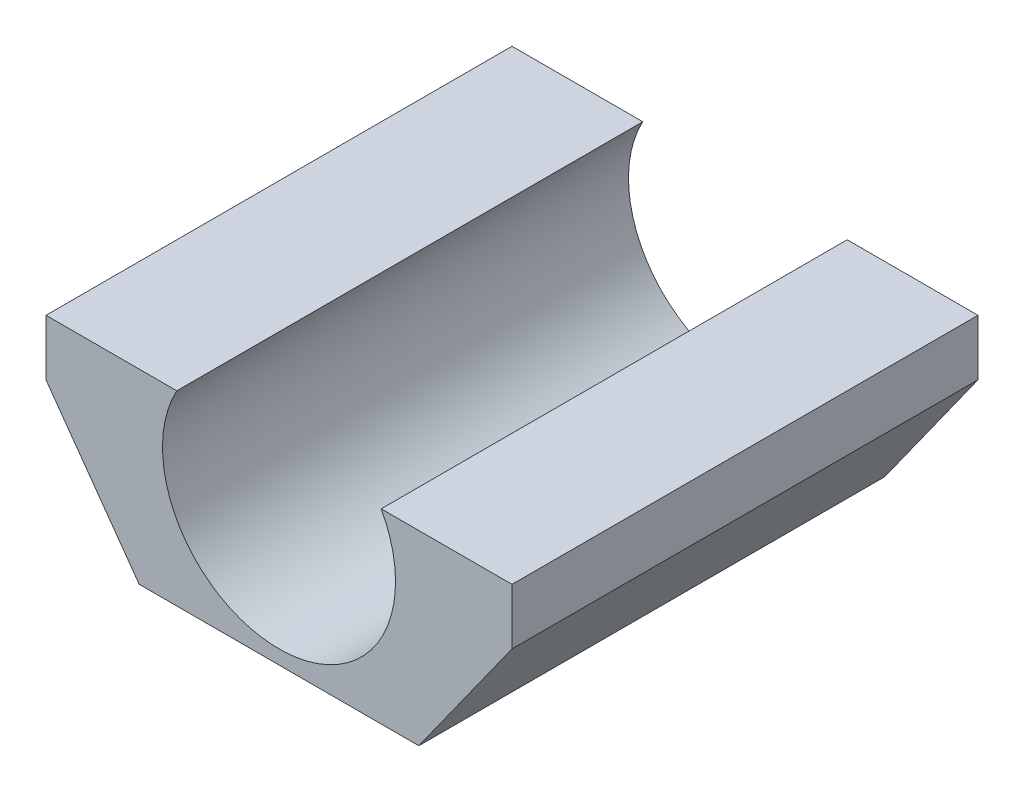
ISO-10303-21;
HEADER;
FILE_DESCRIPTION(('STEP AP214'),'2;1');
FILE_NAME('part.step','',(''),(''),'','','');
FILE_SCHEMA(('AUTOMOTIVE_DESIGN { 1 0 10303 214 1 1 1 1 }'));
ENDSEC;
DATA;
#1=APPLICATION_CONTEXT('core data for automotive mechanical design processes');
#2=APPLICATION_PROTOCOL_DEFINITION('international standard','automotive_design',2000,#1);
#3=PRODUCT_CONTEXT('',#1,'mechanical');
#4=PRODUCT('Part','Part','',(#3));
#5=PRODUCT_RELATED_PRODUCT_CATEGORY('part','',(#4));
#6=PRODUCT_DEFINITION_FORMATION('','',#4);
#7=PRODUCT_DEFINITION_CONTEXT('part definition',#1,'design');
#8=PRODUCT_DEFINITION('design','',#6,#7);
#9=PRODUCT_DEFINITION_SHAPE('','',#8);
#10=(LENGTH_UNIT() NAMED_UNIT(*) SI_UNIT(.MILLI.,.METRE.));
#11=(NAMED_UNIT(*) PLANE_ANGLE_UNIT() SI_UNIT($,.RADIAN.));
#12=(NAMED_UNIT(*) SI_UNIT($,.STERADIAN.) SOLID_ANGLE_UNIT());
#13=UNCERTAINTY_MEASURE_WITH_UNIT(LENGTH_MEASURE(1.E-05),#10,'distance_accuracy_value','');
#14=(GEOMETRIC_REPRESENTATION_CONTEXT(3) GLOBAL_UNCERTAINTY_ASSIGNED_CONTEXT((#13)) GLOBAL_UNIT_ASSIGNED_CONTEXT((#10,
#11,#12)) REPRESENTATION_CONTEXT('',''));
#15=CARTESIAN_POINT('',(0.,0.,0.));
#16=DIRECTION('',(0.,0.,1.));
#17=DIRECTION('',(1.,0.,0.));
#18=AXIS2_PLACEMENT_3D('',#15,#16,#17);
#19=CARTESIAN_POINT('',(0.,6.,0.));
#20=DIRECTION('',(0.,1.,0.));
#21=DIRECTION('',(0.,0.,1.));
#22=AXIS2_PLACEMENT_3D('',#19,#20,#21);
#23=PLANE('',#22);
#24=DIRECTION('',(-1.,0.,0.));
#25=VECTOR('',#24,1.);
#26=CARTESIAN_POINT('',(0.,6.,50.));
#27=LINE('',#26,#25);
#28=CARTESIAN_POINT('',(25.,6.,50.));
#29=VERTEX_POINT('',#28);
#30=CARTESIAN_POINT('',(10.9658560997307,6.,50.));
#31=VERTEX_POINT('',#30);
#32=EDGE_CURVE('E125',#29,#31,#27,.T.);
#33=ORIENTED_EDGE('',*,*,#32,.F.);
#34=DIRECTION('',(0.,0.,1.));
#35=VECTOR('',#34,1.);
#36=CARTESIAN_POINT('',(25.,6.,50.));
#37=LINE('',#36,#35);
#38=CARTESIAN_POINT('',(25.,6.,0.));
#39=VERTEX_POINT('',#38);
#40=EDGE_CURVE('E114',#39,#29,#37,.T.);
#41=ORIENTED_EDGE('',*,*,#40,.F.);
#42=DIRECTION('',(-1.,0.,0.));
#43=VECTOR('',#42,1.);
#44=CARTESIAN_POINT('',(0.,6.,0.));
#45=LINE('',#44,#43);
#46=CARTESIAN_POINT('',(10.9658560997307,6.,0.));
#47=VERTEX_POINT('',#46);
#48=EDGE_CURVE('E124',#39,#47,#45,.T.);
#49=ORIENTED_EDGE('',*,*,#48,.T.);
#50=DIRECTION('',(0.,0.,-1.));
#51=VECTOR('',#50,1.);
#52=CARTESIAN_POINT('',(10.9658560997307,6.,50.));
#53=LINE('',#52,#51);
#54=EDGE_CURVE('E126',#31,#47,#53,.T.);
#55=ORIENTED_EDGE('',*,*,#54,.F.);
#56=EDGE_LOOP('',(#33,#41,#49,#55));
#57=FACE_BOUND('',#56,.T.);
#58=ADVANCED_FACE('F39',(#57),#23,.T.);
#59=CARTESIAN_POINT('',(-10.9658560997307,6.,50.));
#60=VERTEX_POINT('',#59);
#61=CARTESIAN_POINT('',(-25.,6.,50.));
#62=VERTEX_POINT('',#61);
#63=EDGE_CURVE('E153',#60,#62,#27,.T.);
#64=ORIENTED_EDGE('',*,*,#63,.F.);
#65=DIRECTION('',(0.,0.,-1.));
#66=VECTOR('',#65,1.);
#67=CARTESIAN_POINT('',(-10.9658560997307,6.,50.));
#68=LINE('',#67,#66);
#69=CARTESIAN_POINT('',(-10.9658560997307,6.,0.));
#70=VERTEX_POINT('',#69);
#71=EDGE_CURVE('E154',#70,#60,#68,.F.);
#72=ORIENTED_EDGE('',*,*,#71,.F.);
#73=CARTESIAN_POINT('',(-25.,6.,0.));
#74=VERTEX_POINT('',#73);
#75=EDGE_CURVE('E132',#70,#74,#45,.T.);
#76=ORIENTED_EDGE('',*,*,#75,.T.);
#77=DIRECTION('',(0.,0.,-1.));
#78=VECTOR('',#77,1.);
#79=CARTESIAN_POINT('',(-25.,6.,50.));
#80=LINE('',#79,#78);
#81=EDGE_CURVE('E127',#62,#74,#80,.T.);
#82=ORIENTED_EDGE('',*,*,#81,.F.);
#83=EDGE_LOOP('',(#64,#72,#76,#82));
#84=FACE_BOUND('',#83,.T.);
#85=ADVANCED_FACE('F188',(#84),#23,.T.);
#86=CARTESIAN_POINT('',(-25.,0.,50.));
#87=DIRECTION('',(-1.,0.,0.));
#88=DIRECTION('',(0.,-1.,0.));
#89=AXIS2_PLACEMENT_3D('',#86,#87,#88);
#90=PLANE('',#89);
#91=DIRECTION('',(0.,1.,0.));
#92=VECTOR('',#91,1.);
#93=CARTESIAN_POINT('',(-25.,0.,50.));
#94=LINE('',#93,#92);
#95=CARTESIAN_POINT('',(-25.,0.,50.));
#96=VERTEX_POINT('',#95);
#97=EDGE_CURVE('E144',#96,#62,#94,.T.);
#98=ORIENTED_EDGE('',*,*,#97,.T.);
#99=ORIENTED_EDGE('',*,*,#81,.T.);
#100=DIRECTION('',(0.,1.,0.));
#101=VECTOR('',#100,1.);
#102=CARTESIAN_POINT('',(-25.,0.,0.));
#103=LINE('',#102,#101);
#104=CARTESIAN_POINT('',(-25.,0.,0.));
#105=VERTEX_POINT('',#104);
#106=EDGE_CURVE('E11',#105,#74,#103,.T.);
#107=ORIENTED_EDGE('',*,*,#106,.F.);
#108=DIRECTION('',(0.,0.,-1.));
#109=VECTOR('',#108,1.);
#110=CARTESIAN_POINT('',(-25.,0.,50.));
#111=LINE('',#110,#109);
#112=EDGE_CURVE('E56',#96,#105,#111,.T.);
#113=ORIENTED_EDGE('',*,*,#112,.F.);
#114=EDGE_LOOP('',(#98,#99,#107,#113));
#115=FACE_BOUND('',#114,.T.);
#116=ADVANCED_FACE('F190',(#115),#90,.T.);
#117=CARTESIAN_POINT('',(25.,0.,50.));
#118=DIRECTION('',(1.,0.,0.));
#119=DIRECTION('',(0.,0.,-1.));
#120=AXIS2_PLACEMENT_3D('',#117,#118,#119);
#121=PLANE('',#120);
#122=DIRECTION('',(0.,-1.,0.));
#123=VECTOR('',#122,1.);
#124=CARTESIAN_POINT('',(25.,0.,0.));
#125=LINE('',#124,#123);
#126=CARTESIAN_POINT('',(25.,0.,0.));
#127=VERTEX_POINT('',#126);
#128=EDGE_CURVE('E86',#39,#127,#125,.T.);
#129=ORIENTED_EDGE('',*,*,#128,.F.);
#130=ORIENTED_EDGE('',*,*,#40,.T.);
#131=DIRECTION('',(0.,-1.,0.));
#132=VECTOR('',#131,1.);
#133=CARTESIAN_POINT('',(25.,0.,50.));
#134=LINE('',#133,#132);
#135=CARTESIAN_POINT('',(25.,0.,50.));
#136=VERTEX_POINT('',#135);
#137=EDGE_CURVE('E141',#29,#136,#134,.T.);
#138=ORIENTED_EDGE('',*,*,#137,.T.);
#139=DIRECTION('',(0.,0.,-1.));
#140=VECTOR('',#139,1.);
#141=CARTESIAN_POINT('',(25.,0.,50.));
#142=LINE('',#141,#140);
#143=EDGE_CURVE('E117',#136,#127,#142,.T.);
#144=ORIENTED_EDGE('',*,*,#143,.T.);
#145=EDGE_LOOP('',(#129,#130,#138,#144));
#146=FACE_BOUND('',#145,.T.);
#147=ADVANCED_FACE('F113',(#146),#121,.T.);
#148=CARTESIAN_POINT('',(0.,0.,50.));
#149=DIRECTION('',(0.,0.,-1.));
#150=DIRECTION('',(-1.,0.,0.));
#151=AXIS2_PLACEMENT_3D('',#148,#149,#150);
#152=CYLINDRICAL_SURFACE('',#151,12.5);
#153=CARTESIAN_POINT('',(0.,0.,50.));
#154=DIRECTION('',(0.,0.,1.));
#155=DIRECTION('',(1.,0.,0.));
#156=AXIS2_PLACEMENT_3D('',#153,#154,#155);
#157=CIRCLE('',#156,12.5);
#158=EDGE_CURVE('E138',#60,#31,#157,.T.);
#159=ORIENTED_EDGE('',*,*,#158,.T.);
#160=ORIENTED_EDGE('',*,*,#54,.T.);
#161=CARTESIAN_POINT('',(0.,0.,0.));
#162=DIRECTION('',(0.,0.,1.));
#163=DIRECTION('',(1.,0.,0.));
#164=AXIS2_PLACEMENT_3D('',#161,#162,#163);
#165=CIRCLE('',#164,12.5);
#166=EDGE_CURVE('E120',#70,#47,#165,.T.);
#167=ORIENTED_EDGE('',*,*,#166,.F.);
#168=ORIENTED_EDGE('',*,*,#71,.T.);
#169=EDGE_LOOP('',(#159,#160,#167,#168));
#170=FACE_BOUND('',#169,.T.);
#171=ADVANCED_FACE('F158',(#170),#152,.F.);
#172=CARTESIAN_POINT('',(0.,0.,50.));
#173=DIRECTION('',(0.,0.,1.));
#174=DIRECTION('',(1.,0.,0.));
#175=AXIS2_PLACEMENT_3D('',#172,#173,#174);
#176=PLANE('',#175);
#177=ORIENTED_EDGE('',*,*,#137,.F.);
#178=ORIENTED_EDGE('',*,*,#32,.T.);
#179=ORIENTED_EDGE('',*,*,#158,.F.);
#180=ORIENTED_EDGE('',*,*,#63,.T.);
#181=ORIENTED_EDGE('',*,*,#97,.F.);
#182=DIRECTION('',(0.581238193719096,-0.813733471206735,0.));
#183=VECTOR('',#182,1.);
#184=CARTESIAN_POINT('',(-16.5540540540541,-11.8243243243243,50.));
#185=LINE('',#184,#183);
#186=CARTESIAN_POINT('',(-15.,-14.,50.));
#187=VERTEX_POINT('',#186);
#188=EDGE_CURVE('E74',#96,#187,#185,.T.);
#189=ORIENTED_EDGE('',*,*,#188,.T.);
#190=DIRECTION('',(-1.,0.,0.));
#191=VECTOR('',#190,1.);
#192=CARTESIAN_POINT('',(0.,-14.,50.));
#193=LINE('',#192,#191);
#194=CARTESIAN_POINT('',(15.,-14.,50.));
#195=VERTEX_POINT('',#194);
#196=EDGE_CURVE('E146',#195,#187,#193,.T.);
#197=ORIENTED_EDGE('',*,*,#196,.F.);
#198=DIRECTION('',(0.581238193719096,0.813733471206735,0.));
#199=VECTOR('',#198,1.);
#200=CARTESIAN_POINT('',(16.5540540540541,-11.8243243243243,50.));
#201=LINE('',#200,#199);
#202=EDGE_CURVE('E143',#195,#136,#201,.T.);
#203=ORIENTED_EDGE('',*,*,#202,.T.);
#204=EDGE_LOOP('',(#177,#178,#179,#180,#181,#189,#197,#203));
#205=FACE_BOUND('',#204,.T.);
#206=ADVANCED_FACE('F41',(#205),#176,.T.);
#207=CARTESIAN_POINT('',(0.,0.,0.));
#208=DIRECTION('',(0.,0.,1.));
#209=DIRECTION('',(1.,0.,0.));
#210=AXIS2_PLACEMENT_3D('',#207,#208,#209);
#211=PLANE('',#210);
#212=ORIENTED_EDGE('',*,*,#48,.F.);
#213=ORIENTED_EDGE('',*,*,#128,.T.);
#214=DIRECTION('',(0.581238193719096,0.813733471206735,0.));
#215=VECTOR('',#214,1.);
#216=CARTESIAN_POINT('',(16.5540540540541,-11.8243243243243,0.));
#217=LINE('',#216,#215);
#218=CARTESIAN_POINT('',(15.,-14.,0.));
#219=VERTEX_POINT('',#218);
#220=EDGE_CURVE('E119',#219,#127,#217,.T.);
#221=ORIENTED_EDGE('',*,*,#220,.F.);
#222=DIRECTION('',(-1.,0.,0.));
#223=VECTOR('',#222,1.);
#224=CARTESIAN_POINT('',(0.,-14.,0.));
#225=LINE('',#224,#223);
#226=CARTESIAN_POINT('',(-15.,-14.,0.));
#227=VERTEX_POINT('',#226);
#228=EDGE_CURVE('E173',#219,#227,#225,.T.);
#229=ORIENTED_EDGE('',*,*,#228,.T.);
#230=DIRECTION('',(0.581238193719096,-0.813733471206735,0.));
#231=VECTOR('',#230,1.);
#232=CARTESIAN_POINT('',(-16.5540540540541,-11.8243243243243,0.));
#233=LINE('',#232,#231);
#234=EDGE_CURVE('E48',#105,#227,#233,.T.);
#235=ORIENTED_EDGE('',*,*,#234,.F.);
#236=ORIENTED_EDGE('',*,*,#106,.T.);
#237=ORIENTED_EDGE('',*,*,#75,.F.);
#238=ORIENTED_EDGE('',*,*,#166,.T.);
#239=EDGE_LOOP('',(#212,#213,#221,#229,#235,#236,#237,#238));
#240=FACE_BOUND('',#239,.T.);
#241=ADVANCED_FACE('F129',(#240),#211,.F.);
#242=CARTESIAN_POINT('',(-16.5540540540541,-11.8243243243243,50.));
#243=DIRECTION('',(0.813733471206735,0.581238193719096,0.));
#244=DIRECTION('',(-0.581238193719096,0.813733471206735,0.));
#245=AXIS2_PLACEMENT_3D('',#242,#243,#244);
#246=PLANE('',#245);
#247=ORIENTED_EDGE('',*,*,#234,.T.);
#248=DIRECTION('',(0.,0.,-1.));
#249=VECTOR('',#248,1.);
#250=CARTESIAN_POINT('',(-15.,-14.,50.));
#251=LINE('',#250,#249);
#252=EDGE_CURVE('E168',#187,#227,#251,.T.);
#253=ORIENTED_EDGE('',*,*,#252,.F.);
#254=ORIENTED_EDGE('',*,*,#188,.F.);
#255=ORIENTED_EDGE('',*,*,#112,.T.);
#256=EDGE_LOOP('',(#247,#253,#254,#255));
#257=FACE_BOUND('',#256,.T.);
#258=ADVANCED_FACE('F176',(#257),#246,.F.);
#259=CARTESIAN_POINT('',(0.,-14.,50.));
#260=DIRECTION('',(0.,-1.,0.));
#261=DIRECTION('',(1.,0.,0.));
#262=AXIS2_PLACEMENT_3D('',#259,#260,#261);
#263=PLANE('',#262);
#264=ORIENTED_EDGE('',*,*,#228,.F.);
#265=DIRECTION('',(0.,0.,-1.));
#266=VECTOR('',#265,1.);
#267=CARTESIAN_POINT('',(15.,-14.,50.));
#268=LINE('',#267,#266);
#269=EDGE_CURVE('E166',#195,#219,#268,.T.);
#270=ORIENTED_EDGE('',*,*,#269,.F.);
#271=ORIENTED_EDGE('',*,*,#196,.T.);
#272=ORIENTED_EDGE('',*,*,#252,.T.);
#273=EDGE_LOOP('',(#264,#270,#271,#272));
#274=FACE_BOUND('',#273,.T.);
#275=ADVANCED_FACE('F179',(#274),#263,.T.);
#276=CARTESIAN_POINT('',(16.5540540540541,-11.8243243243243,50.));
#277=DIRECTION('',(-0.813733471206735,0.581238193719096,0.));
#278=DIRECTION('',(-0.581238193719096,-0.813733471206735,0.));
#279=AXIS2_PLACEMENT_3D('',#276,#277,#278);
#280=PLANE('',#279);
#281=ORIENTED_EDGE('',*,*,#220,.T.);
#282=ORIENTED_EDGE('',*,*,#143,.F.);
#283=ORIENTED_EDGE('',*,*,#202,.F.);
#284=ORIENTED_EDGE('',*,*,#269,.T.);
#285=EDGE_LOOP('',(#281,#282,#283,#284));
#286=FACE_BOUND('',#285,.T.);
#287=ADVANCED_FACE('F165',(#286),#280,.F.);
#288=CLOSED_SHELL('',(#58,#85,#116,#147,#171,#206,#241,#258,#275,#287));
#289=MANIFOLD_SOLID_BREP('B2',#288);
#290=ADVANCED_BREP_SHAPE_REPRESENTATION('',(#18,#289),#14);
#291=SHAPE_DEFINITION_REPRESENTATION(#9,#290);
ENDSEC;
END-ISO-10303-21;
